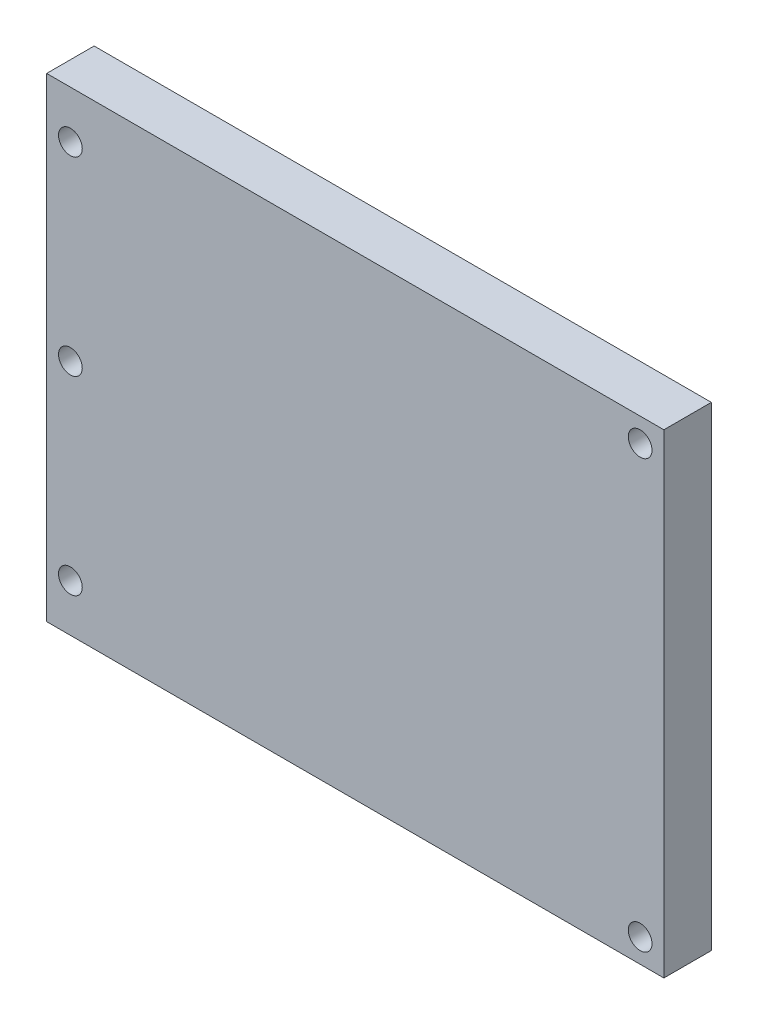
ISO-10303-21;
HEADER;
FILE_DESCRIPTION(('STEP AP214'),'2;1');
FILE_NAME('part.step','',(''),(''),'','','');
FILE_SCHEMA(('AUTOMOTIVE_DESIGN { 1 0 10303 214 1 1 1 1 }'));
ENDSEC;
DATA;
#1=APPLICATION_CONTEXT('core data for automotive mechanical design processes');
#2=APPLICATION_PROTOCOL_DEFINITION('international standard','automotive_design',2000,#1);
#3=PRODUCT_CONTEXT('',#1,'mechanical');
#4=PRODUCT('Part','Part','',(#3));
#5=PRODUCT_RELATED_PRODUCT_CATEGORY('part','',(#4));
#6=PRODUCT_DEFINITION_FORMATION('','',#4);
#7=PRODUCT_DEFINITION_CONTEXT('part definition',#1,'design');
#8=PRODUCT_DEFINITION('design','',#6,#7);
#9=PRODUCT_DEFINITION_SHAPE('','',#8);
#10=(LENGTH_UNIT() NAMED_UNIT(*) SI_UNIT(.MILLI.,.METRE.));
#11=(NAMED_UNIT(*) PLANE_ANGLE_UNIT() SI_UNIT($,.RADIAN.));
#12=(NAMED_UNIT(*) SI_UNIT($,.STERADIAN.) SOLID_ANGLE_UNIT());
#13=UNCERTAINTY_MEASURE_WITH_UNIT(LENGTH_MEASURE(1.E-05),#10,'distance_accuracy_value','');
#14=(GEOMETRIC_REPRESENTATION_CONTEXT(3) GLOBAL_UNCERTAINTY_ASSIGNED_CONTEXT((#13)) GLOBAL_UNIT_ASSIGNED_CONTEXT((#10,
#11,#12)) REPRESENTATION_CONTEXT('',''));
#15=CARTESIAN_POINT('',(0.,0.,0.));
#16=DIRECTION('',(0.,0.,1.));
#17=DIRECTION('',(1.,0.,0.));
#18=AXIS2_PLACEMENT_3D('',#15,#16,#17);
#19=CARTESIAN_POINT('',(0.,0.,10.));
#20=DIRECTION('',(0.,0.,1.));
#21=DIRECTION('',(1.,0.,0.));
#22=AXIS2_PLACEMENT_3D('',#19,#20,#21);
#23=PLANE('',#22);
#24=CARTESIAN_POINT('',(-85.,-40.,10.));
#25=DIRECTION('',(0.,0.,1.));
#26=DIRECTION('',(1.,0.,0.));
#27=AXIS2_PLACEMENT_3D('',#24,#25,#26);
#28=CIRCLE('',#27,2.50000000000001);
#29=CARTESIAN_POINT('',(-82.5,-40.,10.));
#30=VERTEX_POINT('',#29);
#31=EDGE_CURVE('E151',#30,#30,#28,.F.);
#32=ORIENTED_EDGE('',*,*,#31,.T.);
#33=EDGE_LOOP('',(#32));
#34=FACE_BOUND('',#33,.T.);
#35=DIRECTION('',(0.,1.,0.));
#36=VECTOR('',#35,1.);
#37=CARTESIAN_POINT('',(40.,20.,10.));
#38=LINE('',#37,#36);
#39=CARTESIAN_POINT('',(40.,-50.,10.));
#40=VERTEX_POINT('',#39);
#41=CARTESIAN_POINT('',(40.,50.,10.));
#42=VERTEX_POINT('',#41);
#43=EDGE_CURVE('E11',#40,#42,#38,.T.);
#44=ORIENTED_EDGE('',*,*,#43,.T.);
#45=DIRECTION('',(1.,0.,0.));
#46=VECTOR('',#45,1.);
#47=CARTESIAN_POINT('',(40.,50.,10.));
#48=LINE('',#47,#46);
#49=CARTESIAN_POINT('',(-90.,50.,10.));
#50=VERTEX_POINT('',#49);
#51=EDGE_CURVE('E81',#50,#42,#48,.T.);
#52=ORIENTED_EDGE('',*,*,#51,.F.);
#53=DIRECTION('',(0.,1.,0.));
#54=VECTOR('',#53,1.);
#55=CARTESIAN_POINT('',(-90.,20.,10.));
#56=LINE('',#55,#54);
#57=CARTESIAN_POINT('',(-90.,-50.,10.));
#58=VERTEX_POINT('',#57);
#59=EDGE_CURVE('E121',#58,#50,#56,.T.);
#60=ORIENTED_EDGE('',*,*,#59,.F.);
#61=DIRECTION('',(-1.,0.,0.));
#62=VECTOR('',#61,1.);
#63=CARTESIAN_POINT('',(40.,-50.,10.));
#64=LINE('',#63,#62);
#65=EDGE_CURVE('E83',#40,#58,#64,.T.);
#66=ORIENTED_EDGE('',*,*,#65,.F.);
#67=EDGE_LOOP('',(#44,#52,#60,#66));
#68=FACE_BOUND('',#67,.T.);
#69=CARTESIAN_POINT('',(-85.,0.,10.));
#70=DIRECTION('',(0.,0.,1.));
#71=DIRECTION('',(1.,0.,0.));
#72=AXIS2_PLACEMENT_3D('',#69,#70,#71);
#73=CIRCLE('',#72,2.50000000000001);
#74=CARTESIAN_POINT('',(-82.5,0.,10.));
#75=VERTEX_POINT('',#74);
#76=EDGE_CURVE('E113',#75,#75,#73,.T.);
#77=ORIENTED_EDGE('',*,*,#76,.F.);
#78=EDGE_LOOP('',(#77));
#79=FACE_BOUND('',#78,.T.);
#80=CARTESIAN_POINT('',(35.,-45.,10.));
#81=DIRECTION('',(0.,0.,1.));
#82=DIRECTION('',(1.,0.,0.));
#83=AXIS2_PLACEMENT_3D('',#80,#81,#82);
#84=CIRCLE('',#83,2.5);
#85=CARTESIAN_POINT('',(37.5,-45.,10.));
#86=VERTEX_POINT('',#85);
#87=EDGE_CURVE('E146',#86,#86,#84,.T.);
#88=ORIENTED_EDGE('',*,*,#87,.F.);
#89=EDGE_LOOP('',(#88));
#90=FACE_BOUND('',#89,.T.);
#91=CARTESIAN_POINT('',(35.,45.,10.));
#92=DIRECTION('',(0.,0.,-1.));
#93=DIRECTION('',(-1.,0.,0.));
#94=AXIS2_PLACEMENT_3D('',#91,#92,#93);
#95=CIRCLE('',#94,2.5);
#96=CARTESIAN_POINT('',(32.5,45.,10.));
#97=VERTEX_POINT('',#96);
#98=EDGE_CURVE('E97',#97,#97,#95,.T.);
#99=ORIENTED_EDGE('',*,*,#98,.T.);
#100=EDGE_LOOP('',(#99));
#101=FACE_BOUND('',#100,.T.);
#102=CARTESIAN_POINT('',(-85.,40.,10.));
#103=DIRECTION('',(0.,0.,1.));
#104=DIRECTION('',(1.,0.,0.));
#105=AXIS2_PLACEMENT_3D('',#102,#103,#104);
#106=CIRCLE('',#105,2.50000000000001);
#107=CARTESIAN_POINT('',(-82.5,40.,10.));
#108=VERTEX_POINT('',#107);
#109=EDGE_CURVE('E144',#108,#108,#106,.T.);
#110=ORIENTED_EDGE('',*,*,#109,.F.);
#111=EDGE_LOOP('',(#110));
#112=FACE_BOUND('',#111,.T.);
#113=ADVANCED_FACE('F39',(#34,#68,#79,#90,#101,#112),#23,.T.);
#114=CARTESIAN_POINT('',(0.,0.,0.));
#115=DIRECTION('',(0.,0.,1.));
#116=DIRECTION('',(1.,0.,0.));
#117=AXIS2_PLACEMENT_3D('',#114,#115,#116);
#118=PLANE('',#117);
#119=CARTESIAN_POINT('',(35.,45.,0.));
#120=DIRECTION('',(0.,0.,-1.));
#121=DIRECTION('',(-1.,0.,0.));
#122=AXIS2_PLACEMENT_3D('',#119,#120,#121);
#123=CIRCLE('',#122,2.5);
#124=CARTESIAN_POINT('',(32.5,45.,0.));
#125=VERTEX_POINT('',#124);
#126=EDGE_CURVE('E94',#125,#125,#123,.T.);
#127=ORIENTED_EDGE('',*,*,#126,.F.);
#128=EDGE_LOOP('',(#127));
#129=FACE_BOUND('',#128,.T.);
#130=DIRECTION('',(0.,1.,0.));
#131=VECTOR('',#130,1.);
#132=CARTESIAN_POINT('',(40.,20.,0.));
#133=LINE('',#132,#131);
#134=CARTESIAN_POINT('',(40.,-50.,0.));
#135=VERTEX_POINT('',#134);
#136=CARTESIAN_POINT('',(40.,50.,0.));
#137=VERTEX_POINT('',#136);
#138=EDGE_CURVE('E43',#135,#137,#133,.T.);
#139=ORIENTED_EDGE('',*,*,#138,.F.);
#140=DIRECTION('',(1.,0.,0.));
#141=VECTOR('',#140,1.);
#142=CARTESIAN_POINT('',(-90.,-50.,0.));
#143=LINE('',#142,#141);
#144=CARTESIAN_POINT('',(-90.,-50.,0.));
#145=VERTEX_POINT('',#144);
#146=EDGE_CURVE('E109',#145,#135,#143,.T.);
#147=ORIENTED_EDGE('',*,*,#146,.F.);
#148=DIRECTION('',(0.,-1.,0.));
#149=VECTOR('',#148,1.);
#150=CARTESIAN_POINT('',(-90.,-20.,0.));
#151=LINE('',#150,#149);
#152=CARTESIAN_POINT('',(-90.,50.,0.));
#153=VERTEX_POINT('',#152);
#154=EDGE_CURVE('E117',#153,#145,#151,.T.);
#155=ORIENTED_EDGE('',*,*,#154,.F.);
#156=DIRECTION('',(-1.,0.,0.));
#157=VECTOR('',#156,1.);
#158=CARTESIAN_POINT('',(-90.,50.,0.));
#159=LINE('',#158,#157);
#160=EDGE_CURVE('E88',#137,#153,#159,.T.);
#161=ORIENTED_EDGE('',*,*,#160,.F.);
#162=EDGE_LOOP('',(#139,#147,#155,#161));
#163=FACE_BOUND('',#162,.T.);
#164=CARTESIAN_POINT('',(-85.,0.,0.));
#165=DIRECTION('',(0.,0.,1.));
#166=DIRECTION('',(1.,0.,0.));
#167=AXIS2_PLACEMENT_3D('',#164,#165,#166);
#168=CIRCLE('',#167,2.50000000000001);
#169=CARTESIAN_POINT('',(-82.5,0.,0.));
#170=VERTEX_POINT('',#169);
#171=EDGE_CURVE('E114',#170,#170,#168,.T.);
#172=ORIENTED_EDGE('',*,*,#171,.T.);
#173=EDGE_LOOP('',(#172));
#174=FACE_BOUND('',#173,.T.);
#175=CARTESIAN_POINT('',(35.,-45.,0.));
#176=DIRECTION('',(0.,0.,1.));
#177=DIRECTION('',(1.,0.,0.));
#178=AXIS2_PLACEMENT_3D('',#175,#176,#177);
#179=CIRCLE('',#178,2.5);
#180=CARTESIAN_POINT('',(37.5,-45.,0.));
#181=VERTEX_POINT('',#180);
#182=EDGE_CURVE('E100',#181,#181,#179,.T.);
#183=ORIENTED_EDGE('',*,*,#182,.T.);
#184=EDGE_LOOP('',(#183));
#185=FACE_BOUND('',#184,.T.);
#186=CARTESIAN_POINT('',(-85.,-40.,0.));
#187=DIRECTION('',(0.,0.,1.));
#188=DIRECTION('',(1.,0.,0.));
#189=AXIS2_PLACEMENT_3D('',#186,#187,#188);
#190=CIRCLE('',#189,2.50000000000001);
#191=CARTESIAN_POINT('',(-82.5,-40.,0.));
#192=VERTEX_POINT('',#191);
#193=EDGE_CURVE('E139',#192,#192,#190,.F.);
#194=ORIENTED_EDGE('',*,*,#193,.F.);
#195=EDGE_LOOP('',(#194));
#196=FACE_BOUND('',#195,.T.);
#197=CARTESIAN_POINT('',(-85.,40.,0.));
#198=DIRECTION('',(0.,0.,1.));
#199=DIRECTION('',(1.,0.,0.));
#200=AXIS2_PLACEMENT_3D('',#197,#198,#199);
#201=CIRCLE('',#200,2.50000000000001);
#202=CARTESIAN_POINT('',(-82.5,40.,0.));
#203=VERTEX_POINT('',#202);
#204=EDGE_CURVE('E142',#203,#203,#201,.T.);
#205=ORIENTED_EDGE('',*,*,#204,.T.);
#206=EDGE_LOOP('',(#205));
#207=FACE_BOUND('',#206,.T.);
#208=ADVANCED_FACE('F127',(#129,#163,#174,#185,#196,#207),#118,.F.);
#209=CARTESIAN_POINT('',(40.,20.,10.));
#210=DIRECTION('',(-1.,0.,0.));
#211=DIRECTION('',(0.,-1.,0.));
#212=AXIS2_PLACEMENT_3D('',#209,#210,#211);
#213=PLANE('',#212);
#214=ORIENTED_EDGE('',*,*,#138,.T.);
#215=DIRECTION('',(0.,0.,-1.));
#216=VECTOR('',#215,1.);
#217=CARTESIAN_POINT('',(40.,50.,0.));
#218=LINE('',#217,#216);
#219=EDGE_CURVE('E85',#42,#137,#218,.T.);
#220=ORIENTED_EDGE('',*,*,#219,.F.);
#221=ORIENTED_EDGE('',*,*,#43,.F.);
#222=DIRECTION('',(0.,0.,1.));
#223=VECTOR('',#222,1.);
#224=CARTESIAN_POINT('',(40.,-50.,0.));
#225=LINE('',#224,#223);
#226=EDGE_CURVE('E111',#135,#40,#225,.T.);
#227=ORIENTED_EDGE('',*,*,#226,.F.);
#228=EDGE_LOOP('',(#214,#220,#221,#227));
#229=FACE_BOUND('',#228,.T.);
#230=ADVANCED_FACE('F41',(#229),#213,.F.);
#231=CARTESIAN_POINT('',(-90.,0.,0.));
#232=DIRECTION('',(1.,0.,0.));
#233=DIRECTION('',(0.,1.,0.));
#234=AXIS2_PLACEMENT_3D('',#231,#232,#233);
#235=PLANE('',#234);
#236=ORIENTED_EDGE('',*,*,#154,.T.);
#237=DIRECTION('',(0.,0.,-1.));
#238=VECTOR('',#237,1.);
#239=CARTESIAN_POINT('',(-90.,-50.,10.));
#240=LINE('',#239,#238);
#241=EDGE_CURVE('E106',#58,#145,#240,.T.);
#242=ORIENTED_EDGE('',*,*,#241,.F.);
#243=ORIENTED_EDGE('',*,*,#59,.T.);
#244=DIRECTION('',(0.,0.,1.));
#245=VECTOR('',#244,1.);
#246=CARTESIAN_POINT('',(-90.,50.,10.));
#247=LINE('',#246,#245);
#248=EDGE_CURVE('E93',#153,#50,#247,.T.);
#249=ORIENTED_EDGE('',*,*,#248,.F.);
#250=EDGE_LOOP('',(#236,#242,#243,#249));
#251=FACE_BOUND('',#250,.T.);
#252=ADVANCED_FACE('F124',(#251),#235,.F.);
#253=CARTESIAN_POINT('',(-85.,0.,0.));
#254=DIRECTION('',(0.,0.,1.));
#255=DIRECTION('',(1.,0.,0.));
#256=AXIS2_PLACEMENT_3D('',#253,#254,#255);
#257=CYLINDRICAL_SURFACE('',#256,2.50000000000001);
#258=ORIENTED_EDGE('',*,*,#171,.F.);
#259=EDGE_LOOP('',(#258));
#260=FACE_BOUND('',#259,.T.);
#261=ORIENTED_EDGE('',*,*,#76,.T.);
#262=EDGE_LOOP('',(#261));
#263=FACE_BOUND('',#262,.T.);
#264=ADVANCED_FACE('F189',(#260,#263),#257,.F.);
#265=CARTESIAN_POINT('',(0.,-50.,0.));
#266=DIRECTION('',(0.,-1.,0.));
#267=DIRECTION('',(0.,0.,-1.));
#268=AXIS2_PLACEMENT_3D('',#265,#266,#267);
#269=PLANE('',#268);
#270=ORIENTED_EDGE('',*,*,#65,.T.);
#271=ORIENTED_EDGE('',*,*,#241,.T.);
#272=ORIENTED_EDGE('',*,*,#146,.T.);
#273=ORIENTED_EDGE('',*,*,#226,.T.);
#274=EDGE_LOOP('',(#270,#271,#272,#273));
#275=FACE_BOUND('',#274,.T.);
#276=ADVANCED_FACE('F126',(#275),#269,.T.);
#277=CARTESIAN_POINT('',(0.,50.,0.));
#278=DIRECTION('',(0.,-1.,0.));
#279=DIRECTION('',(0.,0.,-1.));
#280=AXIS2_PLACEMENT_3D('',#277,#278,#279);
#281=PLANE('',#280);
#282=ORIENTED_EDGE('',*,*,#51,.T.);
#283=ORIENTED_EDGE('',*,*,#219,.T.);
#284=ORIENTED_EDGE('',*,*,#160,.T.);
#285=ORIENTED_EDGE('',*,*,#248,.T.);
#286=EDGE_LOOP('',(#282,#283,#284,#285));
#287=FACE_BOUND('',#286,.T.);
#288=ADVANCED_FACE('F91',(#287),#281,.F.);
#289=CARTESIAN_POINT('',(35.,-45.,0.));
#290=DIRECTION('',(0.,0.,1.));
#291=DIRECTION('',(1.,0.,0.));
#292=AXIS2_PLACEMENT_3D('',#289,#290,#291);
#293=CYLINDRICAL_SURFACE('',#292,2.5);
#294=ORIENTED_EDGE('',*,*,#182,.F.);
#295=EDGE_LOOP('',(#294));
#296=FACE_BOUND('',#295,.T.);
#297=ORIENTED_EDGE('',*,*,#87,.T.);
#298=EDGE_LOOP('',(#297));
#299=FACE_BOUND('',#298,.T.);
#300=ADVANCED_FACE('F158',(#296,#299),#293,.F.);
#301=CARTESIAN_POINT('',(35.,45.,0.));
#302=DIRECTION('',(0.,0.,1.));
#303=DIRECTION('',(1.,0.,0.));
#304=AXIS2_PLACEMENT_3D('',#301,#302,#303);
#305=CYLINDRICAL_SURFACE('',#304,2.5);
#306=ORIENTED_EDGE('',*,*,#126,.T.);
#307=EDGE_LOOP('',(#306));
#308=FACE_BOUND('',#307,.T.);
#309=ORIENTED_EDGE('',*,*,#98,.F.);
#310=EDGE_LOOP('',(#309));
#311=FACE_BOUND('',#310,.T.);
#312=ADVANCED_FACE('F175',(#308,#311),#305,.F.);
#313=CARTESIAN_POINT('',(-85.,-40.,0.));
#314=DIRECTION('',(0.,0.,1.));
#315=DIRECTION('',(1.,0.,0.));
#316=AXIS2_PLACEMENT_3D('',#313,#314,#315);
#317=CYLINDRICAL_SURFACE('',#316,2.50000000000001);
#318=ORIENTED_EDGE('',*,*,#193,.T.);
#319=EDGE_LOOP('',(#318));
#320=FACE_BOUND('',#319,.T.);
#321=ORIENTED_EDGE('',*,*,#31,.F.);
#322=EDGE_LOOP('',(#321));
#323=FACE_BOUND('',#322,.T.);
#324=ADVANCED_FACE('F170',(#320,#323),#317,.F.);
#325=CARTESIAN_POINT('',(-85.,40.,0.));
#326=DIRECTION('',(0.,0.,1.));
#327=DIRECTION('',(1.,0.,0.));
#328=AXIS2_PLACEMENT_3D('',#325,#326,#327);
#329=CYLINDRICAL_SURFACE('',#328,2.50000000000001);
#330=ORIENTED_EDGE('',*,*,#204,.F.);
#331=EDGE_LOOP('',(#330));
#332=FACE_BOUND('',#331,.T.);
#333=ORIENTED_EDGE('',*,*,#109,.T.);
#334=EDGE_LOOP('',(#333));
#335=FACE_BOUND('',#334,.T.);
#336=ADVANCED_FACE('F168',(#332,#335),#329,.F.);
#337=CLOSED_SHELL('',(#113,#208,#230,#252,#264,#276,#288,#300,#312,#324,#336));
#338=MANIFOLD_SOLID_BREP('B2',#337);
#339=ADVANCED_BREP_SHAPE_REPRESENTATION('',(#18,#338),#14);
#340=SHAPE_DEFINITION_REPRESENTATION(#9,#339);
ENDSEC;
END-ISO-10303-21;
